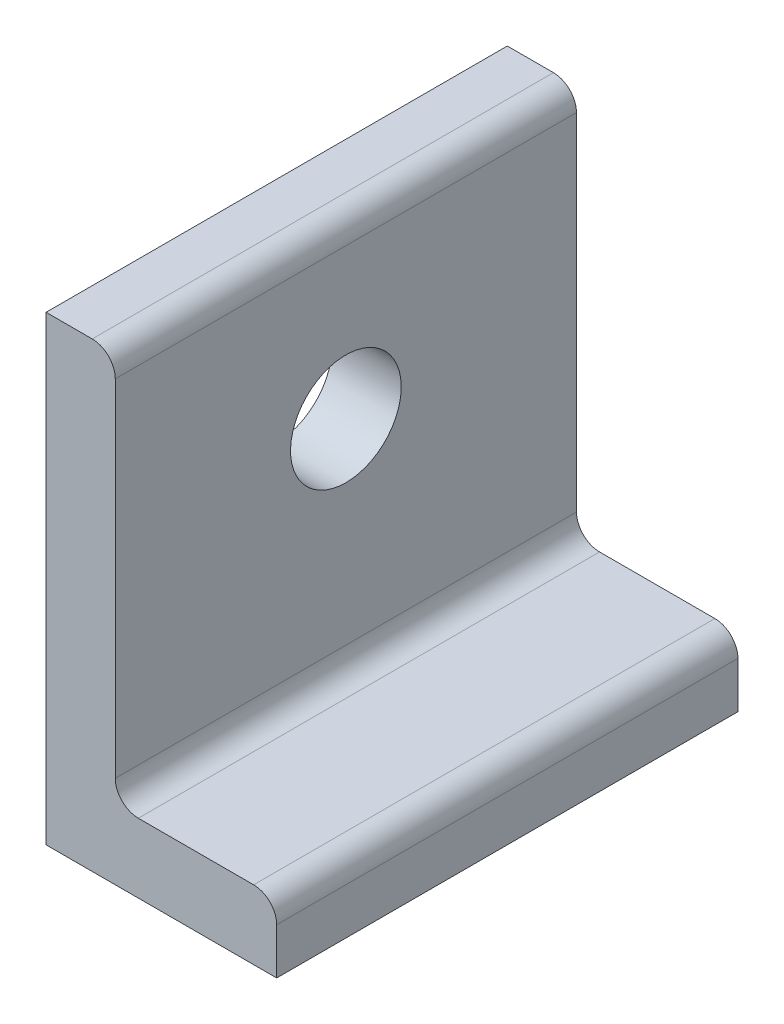
ISO-10303-21;
HEADER;
FILE_DESCRIPTION(('STEP AP214'),'2;1');
FILE_NAME('part.step','',(''),(''),'','','');
FILE_SCHEMA(('AUTOMOTIVE_DESIGN { 1 0 10303 214 1 1 1 1 }'));
ENDSEC;
DATA;
#1=APPLICATION_CONTEXT('core data for automotive mechanical design processes');
#2=APPLICATION_PROTOCOL_DEFINITION('international standard','automotive_design',2000,#1);
#3=PRODUCT_CONTEXT('',#1,'mechanical');
#4=PRODUCT('Part','Part','',(#3));
#5=PRODUCT_RELATED_PRODUCT_CATEGORY('part','',(#4));
#6=PRODUCT_DEFINITION_FORMATION('','',#4);
#7=PRODUCT_DEFINITION_CONTEXT('part definition',#1,'design');
#8=PRODUCT_DEFINITION('design','',#6,#7);
#9=PRODUCT_DEFINITION_SHAPE('','',#8);
#10=(LENGTH_UNIT() NAMED_UNIT(*) SI_UNIT(.MILLI.,.METRE.));
#11=(NAMED_UNIT(*) PLANE_ANGLE_UNIT() SI_UNIT($,.RADIAN.));
#12=(NAMED_UNIT(*) SI_UNIT($,.STERADIAN.) SOLID_ANGLE_UNIT());
#13=UNCERTAINTY_MEASURE_WITH_UNIT(LENGTH_MEASURE(1.E-05),#10,'distance_accuracy_value','');
#14=(GEOMETRIC_REPRESENTATION_CONTEXT(3) GLOBAL_UNCERTAINTY_ASSIGNED_CONTEXT((#13)) GLOBAL_UNIT_ASSIGNED_CONTEXT((#10,
#11,#12)) REPRESENTATION_CONTEXT('',''));
#15=CARTESIAN_POINT('',(0.,0.,0.));
#16=DIRECTION('',(0.,0.,1.));
#17=DIRECTION('',(1.,0.,0.));
#18=AXIS2_PLACEMENT_3D('',#15,#16,#17);
#19=CARTESIAN_POINT('',(3.,20.,20.));
#20=DIRECTION('',(0.,-1.,0.));
#21=DIRECTION('',(0.,0.,-1.));
#22=AXIS2_PLACEMENT_3D('',#19,#20,#21);
#23=PLANE('',#22);
#24=DIRECTION('',(-1.,0.,0.));
#25=VECTOR('',#24,1.);
#26=CARTESIAN_POINT('',(3.,20.,20.));
#27=LINE('',#26,#25);
#28=CARTESIAN_POINT('',(2.,20.,20.));
#29=VERTEX_POINT('',#28);
#30=CARTESIAN_POINT('',(0.,20.,20.));
#31=VERTEX_POINT('',#30);
#32=EDGE_CURVE('E109',#29,#31,#27,.T.);
#33=ORIENTED_EDGE('',*,*,#32,.F.);
#34=DIRECTION('',(0.,0.,-1.));
#35=VECTOR('',#34,1.);
#36=CARTESIAN_POINT('',(2.,20.,20.));
#37=LINE('',#36,#35);
#38=CARTESIAN_POINT('',(2.,20.,0.));
#39=VERTEX_POINT('',#38);
#40=EDGE_CURVE('E170',#29,#39,#37,.T.);
#41=ORIENTED_EDGE('',*,*,#40,.T.);
#42=DIRECTION('',(-1.,0.,0.));
#43=VECTOR('',#42,1.);
#44=CARTESIAN_POINT('',(3.,20.,0.));
#45=LINE('',#44,#43);
#46=CARTESIAN_POINT('',(0.,20.,0.));
#47=VERTEX_POINT('',#46);
#48=EDGE_CURVE('E135',#39,#47,#45,.T.);
#49=ORIENTED_EDGE('',*,*,#48,.T.);
#50=DIRECTION('',(0.,0.,-1.));
#51=VECTOR('',#50,1.);
#52=CARTESIAN_POINT('',(0.,20.,20.));
#53=LINE('',#52,#51);
#54=EDGE_CURVE('E127',#31,#47,#53,.T.);
#55=ORIENTED_EDGE('',*,*,#54,.F.);
#56=EDGE_LOOP('',(#33,#41,#49,#55));
#57=FACE_BOUND('',#56,.T.);
#58=ADVANCED_FACE('F39',(#57),#23,.F.);
#59=CARTESIAN_POINT('',(0.,20.,20.));
#60=DIRECTION('',(1.,0.,0.));
#61=DIRECTION('',(0.,1.,0.));
#62=AXIS2_PLACEMENT_3D('',#59,#60,#61);
#63=PLANE('',#62);
#64=CARTESIAN_POINT('',(0.,12.5,10.));
#65=DIRECTION('',(-1.,0.,0.));
#66=DIRECTION('',(0.,-1.,0.));
#67=AXIS2_PLACEMENT_3D('',#64,#65,#66);
#68=CIRCLE('',#67,2.4);
#69=CARTESIAN_POINT('',(0.,10.1,10.));
#70=VERTEX_POINT('',#69);
#71=EDGE_CURVE('E151',#70,#70,#68,.T.);
#72=ORIENTED_EDGE('',*,*,#71,.F.);
#73=EDGE_LOOP('',(#72));
#74=FACE_BOUND('',#73,.T.);
#75=DIRECTION('',(0.,-1.,0.));
#76=VECTOR('',#75,1.);
#77=CARTESIAN_POINT('',(0.,20.,0.));
#78=LINE('',#77,#76);
#79=CARTESIAN_POINT('',(0.,0.,0.));
#80=VERTEX_POINT('',#79);
#81=EDGE_CURVE('E209',#47,#80,#78,.T.);
#82=ORIENTED_EDGE('',*,*,#81,.T.);
#83=DIRECTION('',(0.,0.,-1.));
#84=VECTOR('',#83,1.);
#85=CARTESIAN_POINT('',(0.,0.,20.));
#86=LINE('',#85,#84);
#87=CARTESIAN_POINT('',(0.,0.,20.));
#88=VERTEX_POINT('',#87);
#89=EDGE_CURVE('E129',#88,#80,#86,.T.);
#90=ORIENTED_EDGE('',*,*,#89,.F.);
#91=DIRECTION('',(0.,-1.,0.));
#92=VECTOR('',#91,1.);
#93=CARTESIAN_POINT('',(0.,20.,20.));
#94=LINE('',#93,#92);
#95=EDGE_CURVE('E113',#31,#88,#94,.T.);
#96=ORIENTED_EDGE('',*,*,#95,.F.);
#97=ORIENTED_EDGE('',*,*,#54,.T.);
#98=EDGE_LOOP('',(#82,#90,#96,#97));
#99=FACE_BOUND('',#98,.T.);
#100=ADVANCED_FACE('F126',(#74,#99),#63,.F.);
#101=CARTESIAN_POINT('',(0.,0.,20.));
#102=DIRECTION('',(0.,1.,0.));
#103=DIRECTION('',(0.,0.,1.));
#104=AXIS2_PLACEMENT_3D('',#101,#102,#103);
#105=PLANE('',#104);
#106=DIRECTION('',(1.,0.,0.));
#107=VECTOR('',#106,1.);
#108=CARTESIAN_POINT('',(0.,0.,0.));
#109=LINE('',#108,#107);
#110=CARTESIAN_POINT('',(10.,0.,0.));
#111=VERTEX_POINT('',#110);
#112=EDGE_CURVE('E212',#80,#111,#109,.T.);
#113=ORIENTED_EDGE('',*,*,#112,.T.);
#114=DIRECTION('',(0.,0.,-1.));
#115=VECTOR('',#114,1.);
#116=CARTESIAN_POINT('',(10.,0.,20.));
#117=LINE('',#116,#115);
#118=CARTESIAN_POINT('',(10.,0.,20.));
#119=VERTEX_POINT('',#118);
#120=EDGE_CURVE('E144',#119,#111,#117,.T.);
#121=ORIENTED_EDGE('',*,*,#120,.F.);
#122=DIRECTION('',(1.,0.,0.));
#123=VECTOR('',#122,1.);
#124=CARTESIAN_POINT('',(0.,0.,20.));
#125=LINE('',#124,#123);
#126=EDGE_CURVE('E132',#88,#119,#125,.T.);
#127=ORIENTED_EDGE('',*,*,#126,.F.);
#128=ORIENTED_EDGE('',*,*,#89,.T.);
#129=EDGE_LOOP('',(#113,#121,#127,#128));
#130=FACE_BOUND('',#129,.T.);
#131=ADVANCED_FACE('F238',(#130),#105,.F.);
#132=CARTESIAN_POINT('',(10.,0.,20.));
#133=DIRECTION('',(-1.,0.,0.));
#134=DIRECTION('',(0.,0.,1.));
#135=AXIS2_PLACEMENT_3D('',#132,#133,#134);
#136=PLANE('',#135);
#137=DIRECTION('',(0.,1.,0.));
#138=VECTOR('',#137,1.);
#139=CARTESIAN_POINT('',(10.,0.,0.));
#140=LINE('',#139,#138);
#141=CARTESIAN_POINT('',(10.,2.,0.));
#142=VERTEX_POINT('',#141);
#143=EDGE_CURVE('E193',#111,#142,#140,.T.);
#144=ORIENTED_EDGE('',*,*,#143,.T.);
#145=DIRECTION('',(0.,0.,-1.));
#146=VECTOR('',#145,1.);
#147=CARTESIAN_POINT('',(10.,2.,20.));
#148=LINE('',#147,#146);
#149=CARTESIAN_POINT('',(10.,2.,20.));
#150=VERTEX_POINT('',#149);
#151=EDGE_CURVE('E162',#142,#150,#148,.F.);
#152=ORIENTED_EDGE('',*,*,#151,.T.);
#153=DIRECTION('',(0.,1.,0.));
#154=VECTOR('',#153,1.);
#155=CARTESIAN_POINT('',(10.,0.,20.));
#156=LINE('',#155,#154);
#157=EDGE_CURVE('E203',#119,#150,#156,.T.);
#158=ORIENTED_EDGE('',*,*,#157,.F.);
#159=ORIENTED_EDGE('',*,*,#120,.T.);
#160=EDGE_LOOP('',(#144,#152,#158,#159));
#161=FACE_BOUND('',#160,.T.);
#162=ADVANCED_FACE('F236',(#161),#136,.F.);
#163=CARTESIAN_POINT('',(10.,3.,20.));
#164=DIRECTION('',(0.,-1.,0.));
#165=DIRECTION('',(1.,0.,0.));
#166=AXIS2_PLACEMENT_3D('',#163,#164,#165);
#167=PLANE('',#166);
#168=DIRECTION('',(-1.,0.,0.));
#169=VECTOR('',#168,1.);
#170=CARTESIAN_POINT('',(10.,3.,20.));
#171=LINE('',#170,#169);
#172=CARTESIAN_POINT('',(9.,3.,20.));
#173=VERTEX_POINT('',#172);
#174=CARTESIAN_POINT('',(4.,3.,20.));
#175=VERTEX_POINT('',#174);
#176=EDGE_CURVE('E198',#173,#175,#171,.T.);
#177=ORIENTED_EDGE('',*,*,#176,.F.);
#178=DIRECTION('',(0.,0.,-1.));
#179=VECTOR('',#178,1.);
#180=CARTESIAN_POINT('',(9.,3.,20.));
#181=LINE('',#180,#179);
#182=CARTESIAN_POINT('',(9.,3.,0.));
#183=VERTEX_POINT('',#182);
#184=EDGE_CURVE('E142',#173,#183,#181,.T.);
#185=ORIENTED_EDGE('',*,*,#184,.T.);
#186=DIRECTION('',(-1.,0.,0.));
#187=VECTOR('',#186,1.);
#188=CARTESIAN_POINT('',(10.,3.,0.));
#189=LINE('',#188,#187);
#190=CARTESIAN_POINT('',(4.,3.,0.));
#191=VERTEX_POINT('',#190);
#192=EDGE_CURVE('E184',#183,#191,#189,.T.);
#193=ORIENTED_EDGE('',*,*,#192,.T.);
#194=DIRECTION('',(0.,0.,-1.));
#195=VECTOR('',#194,1.);
#196=CARTESIAN_POINT('',(4.,3.,20.));
#197=LINE('',#196,#195);
#198=EDGE_CURVE('E138',#191,#175,#197,.F.);
#199=ORIENTED_EDGE('',*,*,#198,.T.);
#200=EDGE_LOOP('',(#177,#185,#193,#199));
#201=FACE_BOUND('',#200,.T.);
#202=ADVANCED_FACE('F190',(#201),#167,.F.);
#203=CARTESIAN_POINT('',(3.,3.,20.));
#204=DIRECTION('',(-1.,0.,0.));
#205=DIRECTION('',(0.,-1.,0.));
#206=AXIS2_PLACEMENT_3D('',#203,#204,#205);
#207=PLANE('',#206);
#208=CARTESIAN_POINT('',(3.,12.5,10.));
#209=DIRECTION('',(-1.,0.,0.));
#210=DIRECTION('',(0.,-1.,0.));
#211=AXIS2_PLACEMENT_3D('',#208,#209,#210);
#212=CIRCLE('',#211,2.4);
#213=CARTESIAN_POINT('',(3.,10.1,10.));
#214=VERTEX_POINT('',#213);
#215=EDGE_CURVE('E148',#214,#214,#212,.T.);
#216=ORIENTED_EDGE('',*,*,#215,.T.);
#217=EDGE_LOOP('',(#216));
#218=FACE_BOUND('',#217,.T.);
#219=DIRECTION('',(0.,1.,0.));
#220=VECTOR('',#219,1.);
#221=CARTESIAN_POINT('',(3.,3.,0.));
#222=LINE('',#221,#220);
#223=CARTESIAN_POINT('',(3.,4.,0.));
#224=VERTEX_POINT('',#223);
#225=CARTESIAN_POINT('',(3.,19.,0.));
#226=VERTEX_POINT('',#225);
#227=EDGE_CURVE('E122',#224,#226,#222,.T.);
#228=ORIENTED_EDGE('',*,*,#227,.T.);
#229=DIRECTION('',(0.,0.,-1.));
#230=VECTOR('',#229,1.);
#231=CARTESIAN_POINT('',(3.,19.,20.));
#232=LINE('',#231,#230);
#233=CARTESIAN_POINT('',(3.,19.,20.));
#234=VERTEX_POINT('',#233);
#235=EDGE_CURVE('E55',#226,#234,#232,.F.);
#236=ORIENTED_EDGE('',*,*,#235,.T.);
#237=DIRECTION('',(0.,1.,0.));
#238=VECTOR('',#237,1.);
#239=CARTESIAN_POINT('',(3.,3.,20.));
#240=LINE('',#239,#238);
#241=CARTESIAN_POINT('',(3.,4.,20.));
#242=VERTEX_POINT('',#241);
#243=EDGE_CURVE('E196',#242,#234,#240,.T.);
#244=ORIENTED_EDGE('',*,*,#243,.F.);
#245=DIRECTION('',(0.,0.,-1.));
#246=VECTOR('',#245,1.);
#247=CARTESIAN_POINT('',(3.,4.,0.));
#248=LINE('',#247,#246);
#249=EDGE_CURVE('E173',#242,#224,#248,.T.);
#250=ORIENTED_EDGE('',*,*,#249,.T.);
#251=EDGE_LOOP('',(#228,#236,#244,#250));
#252=FACE_BOUND('',#251,.T.);
#253=ADVANCED_FACE('F195',(#218,#252),#207,.F.);
#254=CARTESIAN_POINT('',(0.,0.,20.));
#255=DIRECTION('',(0.,0.,1.));
#256=DIRECTION('',(1.,0.,0.));
#257=AXIS2_PLACEMENT_3D('',#254,#255,#256);
#258=PLANE('',#257);
#259=ORIENTED_EDGE('',*,*,#157,.T.);
#260=CARTESIAN_POINT('',(9.,2.,20.));
#261=DIRECTION('',(0.,0.,1.));
#262=DIRECTION('',(1.,0.,0.));
#263=AXIS2_PLACEMENT_3D('',#260,#261,#262);
#264=CIRCLE('',#263,1.);
#265=EDGE_CURVE('E167',#150,#173,#264,.T.);
#266=ORIENTED_EDGE('',*,*,#265,.T.);
#267=ORIENTED_EDGE('',*,*,#176,.T.);
#268=CARTESIAN_POINT('',(4.,4.,20.));
#269=DIRECTION('',(0.,0.,1.));
#270=DIRECTION('',(1.,0.,0.));
#271=AXIS2_PLACEMENT_3D('',#268,#269,#270);
#272=CIRCLE('',#271,1.);
#273=EDGE_CURVE('E11',#175,#242,#272,.F.);
#274=ORIENTED_EDGE('',*,*,#273,.T.);
#275=ORIENTED_EDGE('',*,*,#243,.T.);
#276=CARTESIAN_POINT('',(2.,19.,20.));
#277=DIRECTION('',(0.,0.,1.));
#278=DIRECTION('',(1.,0.,0.));
#279=AXIS2_PLACEMENT_3D('',#276,#277,#278);
#280=CIRCLE('',#279,1.);
#281=EDGE_CURVE('E116',#234,#29,#280,.T.);
#282=ORIENTED_EDGE('',*,*,#281,.T.);
#283=ORIENTED_EDGE('',*,*,#32,.T.);
#284=ORIENTED_EDGE('',*,*,#95,.T.);
#285=ORIENTED_EDGE('',*,*,#126,.T.);
#286=EDGE_LOOP('',(#259,#266,#267,#274,#275,#282,#283,#284,#285));
#287=FACE_BOUND('',#286,.T.);
#288=ADVANCED_FACE('F112',(#287),#258,.T.);
#289=CARTESIAN_POINT('',(0.,0.,0.));
#290=DIRECTION('',(0.,0.,1.));
#291=DIRECTION('',(1.,0.,0.));
#292=AXIS2_PLACEMENT_3D('',#289,#290,#291);
#293=PLANE('',#292);
#294=ORIENTED_EDGE('',*,*,#192,.F.);
#295=CARTESIAN_POINT('',(9.,2.,0.));
#296=DIRECTION('',(0.,0.,1.));
#297=DIRECTION('',(1.,0.,0.));
#298=AXIS2_PLACEMENT_3D('',#295,#296,#297);
#299=CIRCLE('',#298,1.);
#300=EDGE_CURVE('E159',#183,#142,#299,.F.);
#301=ORIENTED_EDGE('',*,*,#300,.T.);
#302=ORIENTED_EDGE('',*,*,#143,.F.);
#303=ORIENTED_EDGE('',*,*,#112,.F.);
#304=ORIENTED_EDGE('',*,*,#81,.F.);
#305=ORIENTED_EDGE('',*,*,#48,.F.);
#306=CARTESIAN_POINT('',(2.,19.,0.));
#307=DIRECTION('',(0.,0.,1.));
#308=DIRECTION('',(1.,0.,0.));
#309=AXIS2_PLACEMENT_3D('',#306,#307,#308);
#310=CIRCLE('',#309,1.);
#311=EDGE_CURVE('E156',#39,#226,#310,.F.);
#312=ORIENTED_EDGE('',*,*,#311,.T.);
#313=ORIENTED_EDGE('',*,*,#227,.F.);
#314=CARTESIAN_POINT('',(4.,4.,0.));
#315=DIRECTION('',(0.,0.,1.));
#316=DIRECTION('',(1.,0.,0.));
#317=AXIS2_PLACEMENT_3D('',#314,#315,#316);
#318=CIRCLE('',#317,1.);
#319=EDGE_CURVE('E48',#224,#191,#318,.T.);
#320=ORIENTED_EDGE('',*,*,#319,.T.);
#321=EDGE_LOOP('',(#294,#301,#302,#303,#304,#305,#312,#313,#320));
#322=FACE_BOUND('',#321,.T.);
#323=ADVANCED_FACE('F183',(#322),#293,.F.);
#324=CARTESIAN_POINT('',(15.,12.5,10.));
#325=DIRECTION('',(-1.,0.,0.));
#326=DIRECTION('',(0.,-1.,0.));
#327=AXIS2_PLACEMENT_3D('',#324,#325,#326);
#328=CYLINDRICAL_SURFACE('',#327,2.4);
#329=ORIENTED_EDGE('',*,*,#71,.T.);
#330=EDGE_LOOP('',(#329));
#331=FACE_BOUND('',#330,.T.);
#332=ORIENTED_EDGE('',*,*,#215,.F.);
#333=EDGE_LOOP('',(#332));
#334=FACE_BOUND('',#333,.T.);
#335=ADVANCED_FACE('F246',(#331,#334),#328,.F.);
#336=CARTESIAN_POINT('',(9.,2.,20.));
#337=DIRECTION('',(0.,0.,-1.));
#338=DIRECTION('',(-1.,0.,0.));
#339=AXIS2_PLACEMENT_3D('',#336,#337,#338);
#340=CYLINDRICAL_SURFACE('',#339,1.);
#341=ORIENTED_EDGE('',*,*,#265,.F.);
#342=ORIENTED_EDGE('',*,*,#151,.F.);
#343=ORIENTED_EDGE('',*,*,#300,.F.);
#344=ORIENTED_EDGE('',*,*,#184,.F.);
#345=EDGE_LOOP('',(#341,#342,#343,#344));
#346=FACE_BOUND('',#345,.T.);
#347=ADVANCED_FACE('F233',(#346),#340,.T.);
#348=CARTESIAN_POINT('',(2.,19.,20.));
#349=DIRECTION('',(0.,0.,-1.));
#350=DIRECTION('',(-1.,0.,0.));
#351=AXIS2_PLACEMENT_3D('',#348,#349,#350);
#352=CYLINDRICAL_SURFACE('',#351,1.);
#353=ORIENTED_EDGE('',*,*,#281,.F.);
#354=ORIENTED_EDGE('',*,*,#235,.F.);
#355=ORIENTED_EDGE('',*,*,#311,.F.);
#356=ORIENTED_EDGE('',*,*,#40,.F.);
#357=EDGE_LOOP('',(#353,#354,#355,#356));
#358=FACE_BOUND('',#357,.T.);
#359=ADVANCED_FACE('F240',(#358),#352,.T.);
#360=CARTESIAN_POINT('',(4.,4.,20.));
#361=DIRECTION('',(0.,0.,1.));
#362=DIRECTION('',(1.,0.,0.));
#363=AXIS2_PLACEMENT_3D('',#360,#361,#362);
#364=CYLINDRICAL_SURFACE('',#363,1.);
#365=ORIENTED_EDGE('',*,*,#273,.F.);
#366=ORIENTED_EDGE('',*,*,#198,.F.);
#367=ORIENTED_EDGE('',*,*,#319,.F.);
#368=ORIENTED_EDGE('',*,*,#249,.F.);
#369=EDGE_LOOP('',(#365,#366,#367,#368));
#370=FACE_BOUND('',#369,.T.);
#371=ADVANCED_FACE('F41',(#370),#364,.F.);
#372=CLOSED_SHELL('',(#58,#100,#131,#162,#202,#253,#288,#323,#335,#347,#359,#371));
#373=MANIFOLD_SOLID_BREP('B2',#372);
#374=ADVANCED_BREP_SHAPE_REPRESENTATION('',(#18,#373),#14);
#375=SHAPE_DEFINITION_REPRESENTATION(#9,#374);
ENDSEC;
END-ISO-10303-21;
